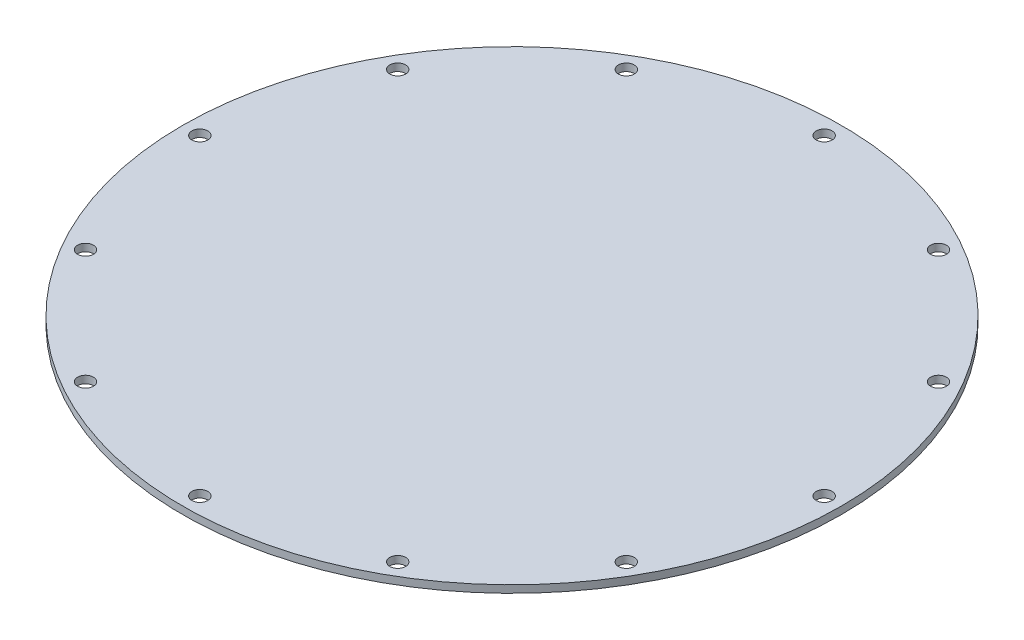
ISO-10303-21;
HEADER;
FILE_DESCRIPTION(('STEP AP214'),'2;1');
FILE_NAME('part.step','',(''),(''),'','','');
FILE_SCHEMA(('AUTOMOTIVE_DESIGN { 1 0 10303 214 1 1 1 1 }'));
ENDSEC;
DATA;
#1=APPLICATION_CONTEXT('core data for automotive mechanical design processes');
#2=APPLICATION_PROTOCOL_DEFINITION('international standard','automotive_design',2000,#1);
#3=PRODUCT_CONTEXT('',#1,'mechanical');
#4=PRODUCT('Part','Part','',(#3));
#5=PRODUCT_RELATED_PRODUCT_CATEGORY('part','',(#4));
#6=PRODUCT_DEFINITION_FORMATION('','',#4);
#7=PRODUCT_DEFINITION_CONTEXT('part definition',#1,'design');
#8=PRODUCT_DEFINITION('design','',#6,#7);
#9=PRODUCT_DEFINITION_SHAPE('','',#8);
#10=(LENGTH_UNIT() NAMED_UNIT(*) SI_UNIT(.MILLI.,.METRE.));
#11=(NAMED_UNIT(*) PLANE_ANGLE_UNIT() SI_UNIT($,.RADIAN.));
#12=(NAMED_UNIT(*) SI_UNIT($,.STERADIAN.) SOLID_ANGLE_UNIT());
#13=UNCERTAINTY_MEASURE_WITH_UNIT(LENGTH_MEASURE(1.E-05),#10,'distance_accuracy_value','');
#14=(GEOMETRIC_REPRESENTATION_CONTEXT(3) GLOBAL_UNCERTAINTY_ASSIGNED_CONTEXT((#13)) GLOBAL_UNIT_ASSIGNED_CONTEXT((#10,
#11,#12)) REPRESENTATION_CONTEXT('',''));
#15=CARTESIAN_POINT('',(0.,0.,0.));
#16=DIRECTION('',(0.,0.,1.));
#17=DIRECTION('',(1.,0.,0.));
#18=AXIS2_PLACEMENT_3D('',#15,#16,#17);
#19=CARTESIAN_POINT('',(0.,20.465,0.));
#20=DIRECTION('',(0.,1.,0.));
#21=DIRECTION('',(-1.,0.,0.));
#22=AXIS2_PLACEMENT_3D('',#19,#20,#21);
#23=PLANE('',#22);
#24=CARTESIAN_POINT('',(-54.5596004384197,20.465,-31.4999999999999));
#25=DIRECTION('',(0.,1.,0.));
#26=DIRECTION('',(-0.499999999999998,0.,0.86602540378444));
#27=AXIS2_PLACEMENT_3D('',#24,#25,#26);
#28=CIRCLE('',#27,1.6);
#29=CARTESIAN_POINT('',(-55.3596004384197,20.465,-30.1143593539448));
#30=VERTEX_POINT('',#29);
#31=EDGE_CURVE('E116',#30,#30,#28,.T.);
#32=ORIENTED_EDGE('',*,*,#31,.F.);
#33=EDGE_LOOP('',(#32));
#34=FACE_BOUND('',#33,.T.);
#35=CARTESIAN_POINT('',(-63.,20.465,2.18347763606644E-13));
#36=DIRECTION('',(0.,1.,0.));
#37=DIRECTION('',(0.,0.,1.));
#38=AXIS2_PLACEMENT_3D('',#35,#36,#37);
#39=CIRCLE('',#38,1.6);
#40=CARTESIAN_POINT('',(-64.6,20.465,2.18347763606644E-13));
#41=VERTEX_POINT('',#40);
#42=EDGE_CURVE('E110',#41,#41,#39,.T.);
#43=ORIENTED_EDGE('',*,*,#42,.F.);
#44=EDGE_LOOP('',(#43));
#45=FACE_BOUND('',#44,.T.);
#46=CARTESIAN_POINT('',(-54.5596004384195,20.465,31.5000000000003));
#47=DIRECTION('',(0.,1.,0.));
#48=DIRECTION('',(0.500000000000004,0.,0.866025403784436));
#49=AXIS2_PLACEMENT_3D('',#46,#47,#48);
#50=CIRCLE('',#49,1.6);
#51=CARTESIAN_POINT('',(-53.7596004384195,20.465,32.8856406460554));
#52=VERTEX_POINT('',#51);
#53=EDGE_CURVE('E104',#52,#52,#50,.T.);
#54=ORIENTED_EDGE('',*,*,#53,.F.);
#55=EDGE_LOOP('',(#54));
#56=FACE_BOUND('',#55,.T.);
#57=CARTESIAN_POINT('',(-31.4999999999997,20.465,54.5596004384198));
#58=DIRECTION('',(0.,1.,0.));
#59=DIRECTION('',(0.866025403784442,0.,0.499999999999995));
#60=AXIS2_PLACEMENT_3D('',#57,#58,#59);
#61=CIRCLE('',#60,1.6);
#62=CARTESIAN_POINT('',(-30.1143593539446,20.465,55.3596004384198));
#63=VERTEX_POINT('',#62);
#64=EDGE_CURVE('E98',#63,#63,#61,.T.);
#65=ORIENTED_EDGE('',*,*,#64,.F.);
#66=EDGE_LOOP('',(#65));
#67=FACE_BOUND('',#66,.T.);
#68=CARTESIAN_POINT('',(0.,20.465,63.));
#69=DIRECTION('',(0.,1.,0.));
#70=DIRECTION('',(1.,0.,0.));
#71=AXIS2_PLACEMENT_3D('',#68,#69,#70);
#72=CIRCLE('',#71,1.6);
#73=CARTESIAN_POINT('',(1.6,20.465,63.));
#74=VERTEX_POINT('',#73);
#75=EDGE_CURVE('E92',#74,#74,#72,.T.);
#76=ORIENTED_EDGE('',*,*,#75,.F.);
#77=EDGE_LOOP('',(#76));
#78=FACE_BOUND('',#77,.T.);
#79=CARTESIAN_POINT('',(31.5000000000004,20.465,54.5596004384194));
#80=DIRECTION('',(0.,1.,0.));
#81=DIRECTION('',(0.866025403784435,0.,-0.500000000000007));
#82=AXIS2_PLACEMENT_3D('',#79,#80,#81);
#83=CIRCLE('',#82,1.6);
#84=CARTESIAN_POINT('',(32.8856406460555,20.465,53.7596004384194));
#85=VERTEX_POINT('',#84);
#86=EDGE_CURVE('E86',#85,#85,#83,.T.);
#87=ORIENTED_EDGE('',*,*,#86,.F.);
#88=EDGE_LOOP('',(#87));
#89=FACE_BOUND('',#88,.T.);
#90=CARTESIAN_POINT('',(54.5596004384199,20.465,31.4999999999995));
#91=DIRECTION('',(0.,1.,0.));
#92=DIRECTION('',(0.499999999999992,0.,-0.866025403784443));
#93=AXIS2_PLACEMENT_3D('',#90,#91,#92);
#94=CIRCLE('',#93,1.6);
#95=CARTESIAN_POINT('',(55.3596004384199,20.465,30.1143593539444));
#96=VERTEX_POINT('',#95);
#97=EDGE_CURVE('E80',#96,#96,#94,.T.);
#98=ORIENTED_EDGE('',*,*,#97,.F.);
#99=EDGE_LOOP('',(#98));
#100=FACE_BOUND('',#99,.T.);
#101=CARTESIAN_POINT('',(63.,20.465,-6.58274412300879E-13));
#102=DIRECTION('',(0.,1.,0.));
#103=DIRECTION('',(0.,0.,-1.));
#104=AXIS2_PLACEMENT_3D('',#101,#102,#103);
#105=CIRCLE('',#104,1.6);
#106=CARTESIAN_POINT('',(63.,20.465,-1.60000000000066));
#107=VERTEX_POINT('',#106);
#108=EDGE_CURVE('E73',#107,#107,#105,.T.);
#109=ORIENTED_EDGE('',*,*,#108,.F.);
#110=EDGE_LOOP('',(#109));
#111=FACE_BOUND('',#110,.T.);
#112=CARTESIAN_POINT('',(54.5596004384193,20.465,-31.5000000000006));
#113=DIRECTION('',(0.,1.,0.));
#114=DIRECTION('',(-0.50000000000001,0.,-0.866025403784433));
#115=AXIS2_PLACEMENT_3D('',#112,#113,#114);
#116=CIRCLE('',#115,1.6);
#117=CARTESIAN_POINT('',(53.7596004384192,20.465,-32.8856406460557));
#118=VERTEX_POINT('',#117);
#119=EDGE_CURVE('E127',#118,#118,#116,.T.);
#120=ORIENTED_EDGE('',*,*,#119,.F.);
#121=EDGE_LOOP('',(#120));
#122=FACE_BOUND('',#121,.T.);
#123=CARTESIAN_POINT('',(31.4999999999993,20.465,-54.55960043842));
#124=DIRECTION('',(0.,1.,0.));
#125=DIRECTION('',(-0.866025403784445,0.,-0.499999999999989));
#126=AXIS2_PLACEMENT_3D('',#123,#124,#125);
#127=CIRCLE('',#126,1.6);
#128=CARTESIAN_POINT('',(30.1143593539442,20.465,-55.35960043842));
#129=VERTEX_POINT('',#128);
#130=EDGE_CURVE('E121',#129,#129,#127,.T.);
#131=ORIENTED_EDGE('',*,*,#130,.F.);
#132=EDGE_LOOP('',(#131));
#133=FACE_BOUND('',#132,.T.);
#134=CARTESIAN_POINT('',(-31.5000000000001,20.465,-54.5596004384196));
#135=DIRECTION('',(0.,1.,0.));
#136=DIRECTION('',(-0.866025403784438,0.,0.500000000000001));
#137=AXIS2_PLACEMENT_3D('',#134,#135,#136);
#138=CIRCLE('',#137,1.6);
#139=CARTESIAN_POINT('',(-32.8856406460552,20.465,-53.7596004384196));
#140=VERTEX_POINT('',#139);
#141=EDGE_CURVE('E67',#140,#140,#138,.T.);
#142=ORIENTED_EDGE('',*,*,#141,.F.);
#143=EDGE_LOOP('',(#142));
#144=FACE_BOUND('',#143,.T.);
#145=CARTESIAN_POINT('',(0.,20.465,-63.));
#146=DIRECTION('',(0.,1.,0.));
#147=DIRECTION('',(-1.,0.,0.));
#148=AXIS2_PLACEMENT_3D('',#145,#146,#147);
#149=CIRCLE('',#148,1.6);
#150=CARTESIAN_POINT('',(-1.60000000000001,20.465,-63.));
#151=VERTEX_POINT('',#150);
#152=EDGE_CURVE('E61',#151,#151,#149,.T.);
#153=ORIENTED_EDGE('',*,*,#152,.F.);
#154=EDGE_LOOP('',(#153));
#155=FACE_BOUND('',#154,.T.);
#156=CARTESIAN_POINT('',(0.,20.465,0.));
#157=DIRECTION('',(0.,1.,0.));
#158=DIRECTION('',(-1.,0.,0.));
#159=AXIS2_PLACEMENT_3D('',#156,#157,#158);
#160=CIRCLE('',#159,66.5);
#161=CARTESIAN_POINT('',(-66.5,20.465,0.));
#162=VERTEX_POINT('',#161);
#163=EDGE_CURVE('E10',#162,#162,#160,.T.);
#164=ORIENTED_EDGE('',*,*,#163,.T.);
#165=EDGE_LOOP('',(#164));
#166=FACE_BOUND('',#165,.T.);
#167=ADVANCED_FACE('F47',(#34,#45,#56,#67,#78,#89,#100,#111,#122,#133,#144,#155,#166),#23,.T.);
#168=CARTESIAN_POINT('',(0.,20.465,0.));
#169=DIRECTION('',(0.,1.,0.));
#170=DIRECTION('',(-1.,0.,0.));
#171=AXIS2_PLACEMENT_3D('',#168,#169,#170);
#172=CYLINDRICAL_SURFACE('',#171,66.5);
#173=CARTESIAN_POINT('',(0.,18.965,0.));
#174=DIRECTION('',(0.,1.,0.));
#175=DIRECTION('',(-1.,0.,0.));
#176=AXIS2_PLACEMENT_3D('',#173,#174,#175);
#177=CIRCLE('',#176,66.5);
#178=CARTESIAN_POINT('',(-66.5,18.965,0.));
#179=VERTEX_POINT('',#178);
#180=EDGE_CURVE('E53',#179,#179,#177,.T.);
#181=ORIENTED_EDGE('',*,*,#180,.T.);
#182=EDGE_LOOP('',(#181));
#183=FACE_BOUND('',#182,.T.);
#184=ORIENTED_EDGE('',*,*,#163,.F.);
#185=EDGE_LOOP('',(#184));
#186=FACE_BOUND('',#185,.T.);
#187=ADVANCED_FACE('F146',(#183,#186),#172,.T.);
#188=CARTESIAN_POINT('',(0.,18.965,0.));
#189=DIRECTION('',(0.,-1.,0.));
#190=DIRECTION('',(1.,0.,0.));
#191=AXIS2_PLACEMENT_3D('',#188,#189,#190);
#192=PLANE('',#191);
#193=CARTESIAN_POINT('',(-54.5596004384197,18.965,-31.4999999999999));
#194=DIRECTION('',(0.,1.,0.));
#195=DIRECTION('',(-0.499999999999998,0.,0.86602540378444));
#196=AXIS2_PLACEMENT_3D('',#193,#194,#195);
#197=CIRCLE('',#196,1.6);
#198=CARTESIAN_POINT('',(-55.3596004384197,18.965,-30.1143593539448));
#199=VERTEX_POINT('',#198);
#200=EDGE_CURVE('E70',#199,#199,#197,.T.);
#201=ORIENTED_EDGE('',*,*,#200,.T.);
#202=EDGE_LOOP('',(#201));
#203=FACE_BOUND('',#202,.T.);
#204=CARTESIAN_POINT('',(-63.,18.965,2.1846617753827E-13));
#205=DIRECTION('',(0.,1.,0.));
#206=DIRECTION('',(0.,0.,1.));
#207=AXIS2_PLACEMENT_3D('',#204,#205,#206);
#208=CIRCLE('',#207,1.6);
#209=CARTESIAN_POINT('',(-64.6,18.965,2.1846617753827E-13));
#210=VERTEX_POINT('',#209);
#211=EDGE_CURVE('E113',#210,#210,#208,.T.);
#212=ORIENTED_EDGE('',*,*,#211,.T.);
#213=EDGE_LOOP('',(#212));
#214=FACE_BOUND('',#213,.T.);
#215=CARTESIAN_POINT('',(-54.5596004384195,18.965,31.5000000000003));
#216=DIRECTION('',(0.,1.,0.));
#217=DIRECTION('',(0.500000000000004,0.,0.866025403784436));
#218=AXIS2_PLACEMENT_3D('',#215,#216,#217);
#219=CIRCLE('',#218,1.6);
#220=CARTESIAN_POINT('',(-53.7596004384195,18.965,32.8856406460554));
#221=VERTEX_POINT('',#220);
#222=EDGE_CURVE('E107',#221,#221,#219,.T.);
#223=ORIENTED_EDGE('',*,*,#222,.T.);
#224=EDGE_LOOP('',(#223));
#225=FACE_BOUND('',#224,.T.);
#226=CARTESIAN_POINT('',(-31.4999999999997,18.965,54.5596004384198));
#227=DIRECTION('',(0.,1.,0.));
#228=DIRECTION('',(0.866025403784442,0.,0.499999999999995));
#229=AXIS2_PLACEMENT_3D('',#226,#227,#228);
#230=CIRCLE('',#229,1.6);
#231=CARTESIAN_POINT('',(-30.1143593539446,18.965,55.3596004384198));
#232=VERTEX_POINT('',#231);
#233=EDGE_CURVE('E101',#232,#232,#230,.T.);
#234=ORIENTED_EDGE('',*,*,#233,.T.);
#235=EDGE_LOOP('',(#234));
#236=FACE_BOUND('',#235,.T.);
#237=CARTESIAN_POINT('',(0.,18.965,63.));
#238=DIRECTION('',(0.,1.,0.));
#239=DIRECTION('',(1.,0.,0.));
#240=AXIS2_PLACEMENT_3D('',#237,#238,#239);
#241=CIRCLE('',#240,1.6);
#242=CARTESIAN_POINT('',(1.6,18.965,63.));
#243=VERTEX_POINT('',#242);
#244=EDGE_CURVE('E95',#243,#243,#241,.T.);
#245=ORIENTED_EDGE('',*,*,#244,.T.);
#246=EDGE_LOOP('',(#245));
#247=FACE_BOUND('',#246,.T.);
#248=CARTESIAN_POINT('',(31.5000000000004,18.965,54.5596004384194));
#249=DIRECTION('',(0.,1.,0.));
#250=DIRECTION('',(0.866025403784435,0.,-0.500000000000007));
#251=AXIS2_PLACEMENT_3D('',#248,#249,#250);
#252=CIRCLE('',#251,1.6);
#253=CARTESIAN_POINT('',(32.8856406460555,18.965,53.7596004384194));
#254=VERTEX_POINT('',#253);
#255=EDGE_CURVE('E89',#254,#254,#252,.T.);
#256=ORIENTED_EDGE('',*,*,#255,.T.);
#257=EDGE_LOOP('',(#256));
#258=FACE_BOUND('',#257,.T.);
#259=CARTESIAN_POINT('',(54.5596004384199,18.965,31.4999999999995));
#260=DIRECTION('',(0.,1.,0.));
#261=DIRECTION('',(0.499999999999992,0.,-0.866025403784443));
#262=AXIS2_PLACEMENT_3D('',#259,#260,#261);
#263=CIRCLE('',#262,1.6);
#264=CARTESIAN_POINT('',(55.3596004384199,18.965,30.1143593539444));
#265=VERTEX_POINT('',#264);
#266=EDGE_CURVE('E83',#265,#265,#263,.T.);
#267=ORIENTED_EDGE('',*,*,#266,.T.);
#268=EDGE_LOOP('',(#267));
#269=FACE_BOUND('',#268,.T.);
#270=CARTESIAN_POINT('',(63.,18.965,-6.58392826232504E-13));
#271=DIRECTION('',(0.,1.,0.));
#272=DIRECTION('',(0.,0.,-1.));
#273=AXIS2_PLACEMENT_3D('',#270,#271,#272);
#274=CIRCLE('',#273,1.6);
#275=CARTESIAN_POINT('',(63.,18.965,-1.60000000000066));
#276=VERTEX_POINT('',#275);
#277=EDGE_CURVE('E76',#276,#276,#274,.T.);
#278=ORIENTED_EDGE('',*,*,#277,.T.);
#279=EDGE_LOOP('',(#278));
#280=FACE_BOUND('',#279,.T.);
#281=CARTESIAN_POINT('',(54.5596004384193,18.965,-31.5000000000006));
#282=DIRECTION('',(0.,1.,0.));
#283=DIRECTION('',(-0.50000000000001,0.,-0.866025403784433));
#284=AXIS2_PLACEMENT_3D('',#281,#282,#283);
#285=CIRCLE('',#284,1.6);
#286=CARTESIAN_POINT('',(53.7596004384192,18.965,-32.8856406460557));
#287=VERTEX_POINT('',#286);
#288=EDGE_CURVE('E77',#287,#287,#285,.T.);
#289=ORIENTED_EDGE('',*,*,#288,.T.);
#290=EDGE_LOOP('',(#289));
#291=FACE_BOUND('',#290,.T.);
#292=CARTESIAN_POINT('',(31.4999999999993,18.965,-54.55960043842));
#293=DIRECTION('',(0.,1.,0.));
#294=DIRECTION('',(-0.866025403784445,0.,-0.499999999999989));
#295=AXIS2_PLACEMENT_3D('',#292,#293,#294);
#296=CIRCLE('',#295,1.6);
#297=CARTESIAN_POINT('',(30.1143593539442,18.965,-55.35960043842));
#298=VERTEX_POINT('',#297);
#299=EDGE_CURVE('E124',#298,#298,#296,.T.);
#300=ORIENTED_EDGE('',*,*,#299,.T.);
#301=EDGE_LOOP('',(#300));
#302=FACE_BOUND('',#301,.T.);
#303=CARTESIAN_POINT('',(-31.5000000000001,18.965,-54.5596004384196));
#304=DIRECTION('',(0.,1.,0.));
#305=DIRECTION('',(-0.866025403784438,0.,0.500000000000001));
#306=AXIS2_PLACEMENT_3D('',#303,#304,#305);
#307=CIRCLE('',#306,1.6);
#308=CARTESIAN_POINT('',(-32.8856406460552,18.965,-53.7596004384196));
#309=VERTEX_POINT('',#308);
#310=EDGE_CURVE('E65',#309,#309,#307,.T.);
#311=ORIENTED_EDGE('',*,*,#310,.T.);
#312=EDGE_LOOP('',(#311));
#313=FACE_BOUND('',#312,.T.);
#314=CARTESIAN_POINT('',(0.,18.965,-63.));
#315=DIRECTION('',(0.,1.,0.));
#316=DIRECTION('',(-1.,0.,0.));
#317=AXIS2_PLACEMENT_3D('',#314,#315,#316);
#318=CIRCLE('',#317,1.6);
#319=CARTESIAN_POINT('',(-1.60000000000001,18.965,-63.));
#320=VERTEX_POINT('',#319);
#321=EDGE_CURVE('E57',#320,#320,#318,.T.);
#322=ORIENTED_EDGE('',*,*,#321,.T.);
#323=EDGE_LOOP('',(#322));
#324=FACE_BOUND('',#323,.T.);
#325=ORIENTED_EDGE('',*,*,#180,.F.);
#326=EDGE_LOOP('',(#325));
#327=FACE_BOUND('',#326,.T.);
#328=ADVANCED_FACE('F133',(#203,#214,#225,#236,#247,#258,#269,#280,#291,#302,#313,#324,#327),
#192,.T.);
#329=CARTESIAN_POINT('',(0.,18.965,-63.));
#330=DIRECTION('',(0.,1.,0.));
#331=DIRECTION('',(-1.,0.,0.));
#332=AXIS2_PLACEMENT_3D('',#329,#330,#331);
#333=CYLINDRICAL_SURFACE('',#332,1.6);
#334=ORIENTED_EDGE('',*,*,#321,.F.);
#335=EDGE_LOOP('',(#334));
#336=FACE_BOUND('',#335,.T.);
#337=ORIENTED_EDGE('',*,*,#152,.T.);
#338=EDGE_LOOP('',(#337));
#339=FACE_BOUND('',#338,.T.);
#340=ADVANCED_FACE('F154',(#336,#339),#333,.F.);
#341=CARTESIAN_POINT('',(-31.5000000000001,18.965,-54.5596004384196));
#342=DIRECTION('',(0.,1.,0.));
#343=DIRECTION('',(-1.,0.,0.));
#344=AXIS2_PLACEMENT_3D('',#341,#342,#343);
#345=CYLINDRICAL_SURFACE('',#344,1.6);
#346=ORIENTED_EDGE('',*,*,#310,.F.);
#347=EDGE_LOOP('',(#346));
#348=FACE_BOUND('',#347,.T.);
#349=ORIENTED_EDGE('',*,*,#141,.T.);
#350=EDGE_LOOP('',(#349));
#351=FACE_BOUND('',#350,.T.);
#352=ADVANCED_FACE('F156',(#348,#351),#345,.F.);
#353=CARTESIAN_POINT('',(31.4999999999993,18.965,-54.55960043842));
#354=DIRECTION('',(0.,1.,0.));
#355=DIRECTION('',(-1.,0.,0.));
#356=AXIS2_PLACEMENT_3D('',#353,#354,#355);
#357=CYLINDRICAL_SURFACE('',#356,1.6);
#358=ORIENTED_EDGE('',*,*,#299,.F.);
#359=EDGE_LOOP('',(#358));
#360=FACE_BOUND('',#359,.T.);
#361=ORIENTED_EDGE('',*,*,#130,.T.);
#362=EDGE_LOOP('',(#361));
#363=FACE_BOUND('',#362,.T.);
#364=ADVANCED_FACE('F140',(#360,#363),#357,.F.);
#365=CARTESIAN_POINT('',(54.5596004384193,18.965,-31.5000000000006));
#366=DIRECTION('',(0.,1.,0.));
#367=DIRECTION('',(-1.,0.,0.));
#368=AXIS2_PLACEMENT_3D('',#365,#366,#367);
#369=CYLINDRICAL_SURFACE('',#368,1.6);
#370=ORIENTED_EDGE('',*,*,#288,.F.);
#371=EDGE_LOOP('',(#370));
#372=FACE_BOUND('',#371,.T.);
#373=ORIENTED_EDGE('',*,*,#119,.T.);
#374=EDGE_LOOP('',(#373));
#375=FACE_BOUND('',#374,.T.);
#376=ADVANCED_FACE('F136',(#372,#375),#369,.F.);
#377=CARTESIAN_POINT('',(63.,18.965,-6.58392826232504E-13));
#378=DIRECTION('',(0.,1.,0.));
#379=DIRECTION('',(-1.,0.,0.));
#380=AXIS2_PLACEMENT_3D('',#377,#378,#379);
#381=CYLINDRICAL_SURFACE('',#380,1.6);
#382=ORIENTED_EDGE('',*,*,#277,.F.);
#383=EDGE_LOOP('',(#382));
#384=FACE_BOUND('',#383,.T.);
#385=ORIENTED_EDGE('',*,*,#108,.T.);
#386=EDGE_LOOP('',(#385));
#387=FACE_BOUND('',#386,.T.);
#388=ADVANCED_FACE('F139',(#384,#387),#381,.F.);
#389=CARTESIAN_POINT('',(54.5596004384199,18.965,31.4999999999995));
#390=DIRECTION('',(0.,1.,0.));
#391=DIRECTION('',(-1.,0.,0.));
#392=AXIS2_PLACEMENT_3D('',#389,#390,#391);
#393=CYLINDRICAL_SURFACE('',#392,1.6);
#394=ORIENTED_EDGE('',*,*,#266,.F.);
#395=EDGE_LOOP('',(#394));
#396=FACE_BOUND('',#395,.T.);
#397=ORIENTED_EDGE('',*,*,#97,.T.);
#398=EDGE_LOOP('',(#397));
#399=FACE_BOUND('',#398,.T.);
#400=ADVANCED_FACE('F219',(#396,#399),#393,.F.);
#401=CARTESIAN_POINT('',(31.5000000000004,18.965,54.5596004384194));
#402=DIRECTION('',(0.,1.,0.));
#403=DIRECTION('',(-1.,0.,0.));
#404=AXIS2_PLACEMENT_3D('',#401,#402,#403);
#405=CYLINDRICAL_SURFACE('',#404,1.6);
#406=ORIENTED_EDGE('',*,*,#255,.F.);
#407=EDGE_LOOP('',(#406));
#408=FACE_BOUND('',#407,.T.);
#409=ORIENTED_EDGE('',*,*,#86,.T.);
#410=EDGE_LOOP('',(#409));
#411=FACE_BOUND('',#410,.T.);
#412=ADVANCED_FACE('F228',(#408,#411),#405,.F.);
#413=CARTESIAN_POINT('',(0.,18.965,63.));
#414=DIRECTION('',(0.,1.,0.));
#415=DIRECTION('',(-1.,0.,0.));
#416=AXIS2_PLACEMENT_3D('',#413,#414,#415);
#417=CYLINDRICAL_SURFACE('',#416,1.6);
#418=ORIENTED_EDGE('',*,*,#244,.F.);
#419=EDGE_LOOP('',(#418));
#420=FACE_BOUND('',#419,.T.);
#421=ORIENTED_EDGE('',*,*,#75,.T.);
#422=EDGE_LOOP('',(#421));
#423=FACE_BOUND('',#422,.T.);
#424=ADVANCED_FACE('F238',(#420,#423),#417,.F.);
#425=CARTESIAN_POINT('',(-31.4999999999997,18.965,54.5596004384198));
#426=DIRECTION('',(0.,1.,0.));
#427=DIRECTION('',(-1.,0.,0.));
#428=AXIS2_PLACEMENT_3D('',#425,#426,#427);
#429=CYLINDRICAL_SURFACE('',#428,1.6);
#430=ORIENTED_EDGE('',*,*,#233,.F.);
#431=EDGE_LOOP('',(#430));
#432=FACE_BOUND('',#431,.T.);
#433=ORIENTED_EDGE('',*,*,#64,.T.);
#434=EDGE_LOOP('',(#433));
#435=FACE_BOUND('',#434,.T.);
#436=ADVANCED_FACE('F248',(#432,#435),#429,.F.);
#437=CARTESIAN_POINT('',(-54.5596004384195,18.965,31.5000000000003));
#438=DIRECTION('',(0.,1.,0.));
#439=DIRECTION('',(-1.,0.,0.));
#440=AXIS2_PLACEMENT_3D('',#437,#438,#439);
#441=CYLINDRICAL_SURFACE('',#440,1.6);
#442=ORIENTED_EDGE('',*,*,#222,.F.);
#443=EDGE_LOOP('',(#442));
#444=FACE_BOUND('',#443,.T.);
#445=ORIENTED_EDGE('',*,*,#53,.T.);
#446=EDGE_LOOP('',(#445));
#447=FACE_BOUND('',#446,.T.);
#448=ADVANCED_FACE('F258',(#444,#447),#441,.F.);
#449=CARTESIAN_POINT('',(-63.,18.965,2.1846617753827E-13));
#450=DIRECTION('',(0.,1.,0.));
#451=DIRECTION('',(-1.,0.,0.));
#452=AXIS2_PLACEMENT_3D('',#449,#450,#451);
#453=CYLINDRICAL_SURFACE('',#452,1.6);
#454=CARTESIAN_POINT('',(-64.6,18.965,2.1846617753827E-13));
#455=CARTESIAN_POINT('',(-64.6,18.980625,2.18464944059815E-13));
#456=CARTESIAN_POINT('',(-64.6,18.99625,2.18463710581361E-13));
#457=CARTESIAN_POINT('',(-64.6,19.0275,2.18461243624452E-13));
#458=CARTESIAN_POINT('',(-64.6,19.043125,2.18460010145998E-13));
#459=CARTESIAN_POINT('',(-64.6,19.074375,2.18457543189089E-13));
#460=CARTESIAN_POINT('',(-64.6,19.09,2.18456309710634E-13));
#461=CARTESIAN_POINT('',(-64.6,19.12125,2.18453842753725E-13));
#462=CARTESIAN_POINT('',(-64.6,19.136875,2.18452609275271E-13));
#463=CARTESIAN_POINT('',(-64.6,19.168125,2.18450142318362E-13));
#464=CARTESIAN_POINT('',(-64.6,19.18375,2.18448908839908E-13));
#465=CARTESIAN_POINT('',(-64.6,19.215,2.18446441882999E-13));
#466=CARTESIAN_POINT('',(-64.6,19.230625,2.18445208404544E-13));
#467=CARTESIAN_POINT('',(-64.6,19.261875,2.18442741447636E-13));
#468=CARTESIAN_POINT('',(-64.6,19.2775,2.18441507969181E-13));
#469=CARTESIAN_POINT('',(-64.6,19.30875,2.18439041012272E-13));
#470=CARTESIAN_POINT('',(-64.6,19.324375,2.18437807533818E-13));
#471=CARTESIAN_POINT('',(-64.6,19.355625,2.18435340576909E-13));
#472=CARTESIAN_POINT('',(-64.6,19.37125,2.18434107098454E-13));
#473=CARTESIAN_POINT('',(-64.6,19.4025,2.18431640141546E-13));
#474=CARTESIAN_POINT('',(-64.6,19.418125,2.18430406663091E-13));
#475=CARTESIAN_POINT('',(-64.6,19.449375,2.18427939706182E-13));
#476=CARTESIAN_POINT('',(-64.6,19.465,2.18426706227728E-13));
#477=CARTESIAN_POINT('',(-64.6,19.49625,2.18424239270819E-13));
#478=CARTESIAN_POINT('',(-64.6,19.511875,2.18423005792365E-13));
#479=CARTESIAN_POINT('',(-64.6,19.543125,2.18420538835456E-13));
#480=CARTESIAN_POINT('',(-64.6,19.55875,2.18419305357001E-13));
#481=CARTESIAN_POINT('',(-64.6,19.59,2.18416838400092E-13));
#482=CARTESIAN_POINT('',(-64.6,19.605625,2.18415604921638E-13));
#483=CARTESIAN_POINT('',(-64.6,19.636875,2.18413137964729E-13));
#484=CARTESIAN_POINT('',(-64.6,19.6525,2.18411904486275E-13));
#485=CARTESIAN_POINT('',(-64.6,19.68375,2.18409437529366E-13));
#486=CARTESIAN_POINT('',(-64.6,19.699375,2.18408204050911E-13));
#487=CARTESIAN_POINT('',(-64.6,19.730625,2.18405737094003E-13));
#488=CARTESIAN_POINT('',(-64.6,19.74625,2.18404503615548E-13));
#489=CARTESIAN_POINT('',(-64.6,19.7775,2.18402036658639E-13));
#490=CARTESIAN_POINT('',(-64.6,19.793125,2.18400803180185E-13));
#491=CARTESIAN_POINT('',(-64.6,19.824375,2.18398336223276E-13));
#492=CARTESIAN_POINT('',(-64.6,19.84,2.18397102744822E-13));
#493=CARTESIAN_POINT('',(-64.6,19.87125,2.18394635787913E-13));
#494=CARTESIAN_POINT('',(-64.6,19.886875,2.18393402309458E-13));
#495=CARTESIAN_POINT('',(-64.6,19.918125,2.18390935352549E-13));
#496=CARTESIAN_POINT('',(-64.6,19.93375,2.18389701874095E-13));
#497=CARTESIAN_POINT('',(-64.6,19.965,2.18387234917186E-13));
#498=CARTESIAN_POINT('',(-64.6,19.980625,2.18386001438732E-13));
#499=CARTESIAN_POINT('',(-64.6,20.011875,2.18383534481823E-13));
#500=CARTESIAN_POINT('',(-64.6,20.0275,2.18382301003368E-13));
#501=CARTESIAN_POINT('',(-64.6,20.05875,2.1837983404646E-13));
#502=CARTESIAN_POINT('',(-64.6,20.074375,2.18378600568005E-13));
#503=CARTESIAN_POINT('',(-64.6,20.105625,2.18376133611096E-13));
#504=CARTESIAN_POINT('',(-64.6,20.12125,2.18374900132642E-13));
#505=CARTESIAN_POINT('',(-64.6,20.1525,2.18372433175733E-13));
#506=CARTESIAN_POINT('',(-64.6,20.168125,2.18371199697279E-13));
#507=CARTESIAN_POINT('',(-64.6,20.199375,2.1836873274037E-13));
#508=CARTESIAN_POINT('',(-64.6,20.215,2.18367499261915E-13));
#509=CARTESIAN_POINT('',(-64.6,20.24625,2.18365032305006E-13));
#510=CARTESIAN_POINT('',(-64.6,20.261875,2.18363798826552E-13));
#511=CARTESIAN_POINT('',(-64.6,20.293125,2.18361331869643E-13));
#512=CARTESIAN_POINT('',(-64.6,20.30875,2.18360098391189E-13));
#513=CARTESIAN_POINT('',(-64.6,20.34,2.1835763143428E-13));
#514=CARTESIAN_POINT('',(-64.6,20.355625,2.18356397955825E-13));
#515=CARTESIAN_POINT('',(-64.6,20.386875,2.18353930998917E-13));
#516=CARTESIAN_POINT('',(-64.6,20.4025,2.18352697520462E-13));
#517=CARTESIAN_POINT('',(-64.6,20.43375,2.18350230563553E-13));
#518=CARTESIAN_POINT('',(-64.6,20.449375,2.18348997085099E-13));
#519=CARTESIAN_POINT('',(-64.6,20.465,2.18347763606644E-13));
#520=B_SPLINE_CURVE_WITH_KNOTS('',3,(#454,#455,#456,#457,#458,#459,#460,#461,#462,#463,#464,
#465,#466,#467,#468,#469,#470,#471,#472,#473,#474,#475,#476,#477,#478,#479,#480,#481,#482,#483,
#484,#485,#486,#487,#488,#489,#490,#491,#492,#493,#494,#495,#496,#497,#498,#499,#500,#501,#502,
#503,#504,#505,#506,#507,#508,#509,#510,#511,#512,#513,#514,#515,#516,#517,#518,#519),
.UNSPECIFIED.,.F.,.F.,(4,2,2,2,2,2,2,2,2,2,2,2,2,2,2,2,2,2,2,2,2,2,2,2,2,2,2,2,2,2,2,2,4),(0.,
0.0468749999999983,0.0937500000000001,0.140625000000002,0.1875,0.234375000000002,
0.281250000000004,0.328125000000005,0.375000000000004,0.421875000000006,0.468750000000007,
0.515625000000006,0.562500000000007,0.609375000000009,0.656250000000011,0.703125000000009,
0.750000000000011,0.796875000000013,0.843750000000011,0.890625000000013,0.937500000000015,
0.984375000000016,1.03125000000001,1.07812500000002,1.12500000000002,1.17187500000002,
1.21875000000002,1.26562500000002,1.31250000000002,1.35937500000002,1.40625000000002,
1.45312500000002,1.50000000000003),.UNSPECIFIED.);
#521=EDGE_CURVE('BSEAM268',#210,#41,#520,.T.);
#522=ORIENTED_EDGE('',*,*,#211,.F.);
#523=ORIENTED_EDGE('',*,*,#42,.T.);
#524=ORIENTED_EDGE('',*,*,#521,.T.);
#525=ORIENTED_EDGE('',*,*,#521,.F.);
#526=EDGE_LOOP('',(#522,#524,#523,#525));
#527=FACE_BOUND('',#526,.T.);
#528=ADVANCED_FACE('F268',(#527),#453,.F.);
#529=CARTESIAN_POINT('',(-54.5596004384197,18.965,-31.4999999999999));
#530=DIRECTION('',(0.,1.,0.));
#531=DIRECTION('',(-1.,0.,0.));
#532=AXIS2_PLACEMENT_3D('',#529,#530,#531);
#533=CYLINDRICAL_SURFACE('',#532,1.6);
#534=ORIENTED_EDGE('',*,*,#200,.F.);
#535=EDGE_LOOP('',(#534));
#536=FACE_BOUND('',#535,.T.);
#537=ORIENTED_EDGE('',*,*,#31,.T.);
#538=EDGE_LOOP('',(#537));
#539=FACE_BOUND('',#538,.T.);
#540=ADVANCED_FACE('F278',(#536,#539),#533,.F.);
#541=CLOSED_SHELL('',(#167,#187,#328,#340,#352,#364,#376,#388,#400,#412,#424,#436,#448,#528,#540));
#542=MANIFOLD_SOLID_BREP('B2',#541);
#543=ADVANCED_BREP_SHAPE_REPRESENTATION('',(#18,#542),#14);
#544=SHAPE_DEFINITION_REPRESENTATION(#9,#543);
ENDSEC;
END-ISO-10303-21;
